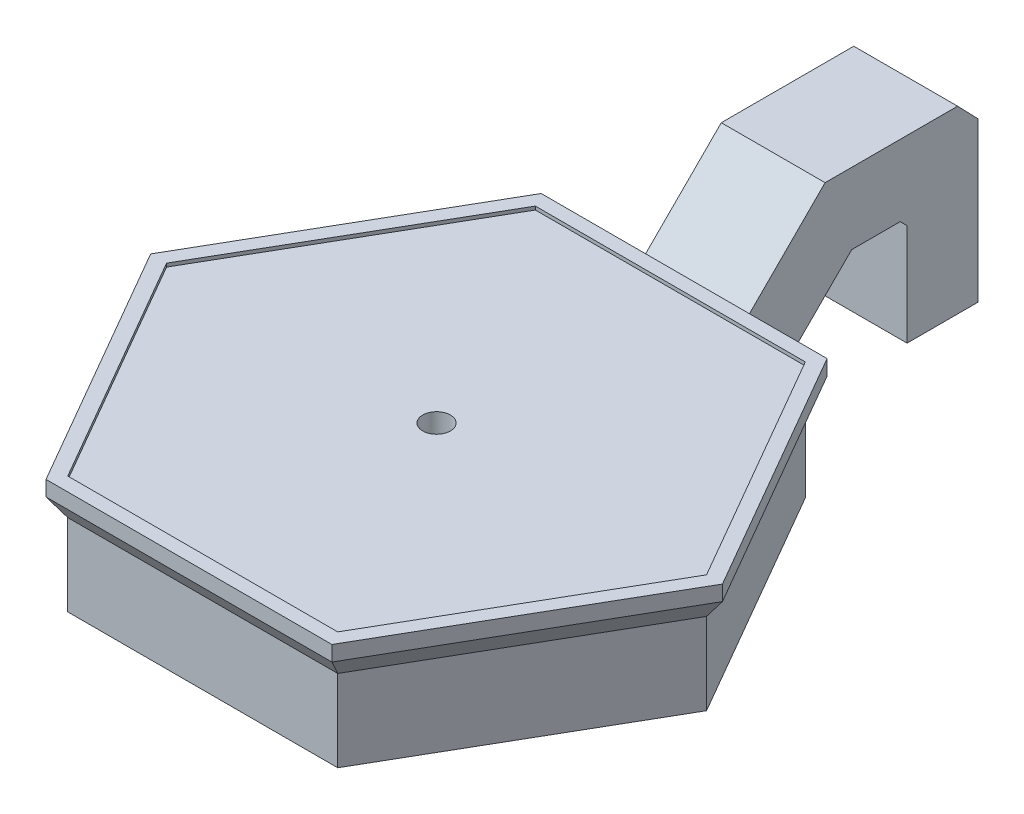
ISO-10303-21;
HEADER;
FILE_DESCRIPTION(('STEP AP214'),'2;1');
FILE_NAME('part.step','',(''),(''),'','','');
FILE_SCHEMA(('AUTOMOTIVE_DESIGN { 1 0 10303 214 1 1 1 1 }'));
ENDSEC;
DATA;
#1=APPLICATION_CONTEXT('core data for automotive mechanical design processes');
#2=APPLICATION_PROTOCOL_DEFINITION('international standard','automotive_design',2000,#1);
#3=PRODUCT_CONTEXT('',#1,'mechanical');
#4=PRODUCT('Part','Part','',(#3));
#5=PRODUCT_RELATED_PRODUCT_CATEGORY('part','',(#4));
#6=PRODUCT_DEFINITION_FORMATION('','',#4);
#7=PRODUCT_DEFINITION_CONTEXT('part definition',#1,'design');
#8=PRODUCT_DEFINITION('design','',#6,#7);
#9=PRODUCT_DEFINITION_SHAPE('','',#8);
#10=(LENGTH_UNIT() NAMED_UNIT(*) SI_UNIT(.MILLI.,.METRE.));
#11=(NAMED_UNIT(*) PLANE_ANGLE_UNIT() SI_UNIT($,.RADIAN.));
#12=(NAMED_UNIT(*) SI_UNIT($,.STERADIAN.) SOLID_ANGLE_UNIT());
#13=UNCERTAINTY_MEASURE_WITH_UNIT(LENGTH_MEASURE(1.E-05),#10,'distance_accuracy_value','');
#14=(GEOMETRIC_REPRESENTATION_CONTEXT(3) GLOBAL_UNCERTAINTY_ASSIGNED_CONTEXT((#13)) GLOBAL_UNIT_ASSIGNED_CONTEXT((#10,
#11,#12)) REPRESENTATION_CONTEXT('',''));
#15=CARTESIAN_POINT('',(0.,0.,0.));
#16=DIRECTION('',(0.,0.,1.));
#17=DIRECTION('',(1.,0.,0.));
#18=AXIS2_PLACEMENT_3D('',#15,#16,#17);
#19=CARTESIAN_POINT('',(19.5,11.8,-33.7749907475931));
#20=DIRECTION('',(0.,0.,1.));
#21=DIRECTION('',(1.,0.,0.));
#22=AXIS2_PLACEMENT_3D('',#19,#20,#21);
#23=PLANE('',#22);
#24=DIRECTION('',(0.,-1.,0.));
#25=VECTOR('',#24,1.);
#26=CARTESIAN_POINT('',(7.5,11.8,-33.7749907475931));
#27=LINE('',#26,#25);
#28=CARTESIAN_POINT('',(7.5,11.8,-33.7749907475931));
#29=VERTEX_POINT('',#28);
#30=CARTESIAN_POINT('',(7.5,0.,-33.7749907475931));
#31=VERTEX_POINT('',#30);
#32=EDGE_CURVE('E288',#29,#31,#27,.T.);
#33=ORIENTED_EDGE('',*,*,#32,.F.);
#34=DIRECTION('',(1.,0.,0.));
#35=VECTOR('',#34,1.);
#36=CARTESIAN_POINT('',(0.,11.8,-33.7749907475931));
#37=LINE('',#36,#35);
#38=CARTESIAN_POINT('',(19.5,11.8,-33.7749907475931));
#39=VERTEX_POINT('',#38);
#40=EDGE_CURVE('E659',#39,#29,#37,.F.);
#41=ORIENTED_EDGE('',*,*,#40,.F.);
#42=DIRECTION('',(0.,-1.,0.));
#43=VECTOR('',#42,1.);
#44=CARTESIAN_POINT('',(19.5,11.8,-33.7749907475931));
#45=LINE('',#44,#43);
#46=CARTESIAN_POINT('',(19.5,0.,-33.7749907475931));
#47=VERTEX_POINT('',#46);
#48=EDGE_CURVE('E689',#39,#47,#45,.T.);
#49=ORIENTED_EDGE('',*,*,#48,.T.);
#50=DIRECTION('',(-1.,0.,0.));
#51=VECTOR('',#50,1.);
#52=CARTESIAN_POINT('',(19.5,0.,-33.7749907475931));
#53=LINE('',#52,#51);
#54=EDGE_CURVE('E697',#47,#31,#53,.T.);
#55=ORIENTED_EDGE('',*,*,#54,.T.);
#56=EDGE_LOOP('',(#33,#41,#49,#55));
#57=FACE_BOUND('',#56,.T.);
#58=ADVANCED_FACE('F50',(#57),#23,.F.);
#59=CARTESIAN_POINT('',(-19.5,11.8,33.7749907475931));
#60=DIRECTION('',(0.,0.,-1.));
#61=DIRECTION('',(-1.,0.,0.));
#62=AXIS2_PLACEMENT_3D('',#59,#60,#61);
#63=PLANE('',#62);
#64=DIRECTION('',(1.,0.,0.));
#65=VECTOR('',#64,1.);
#66=CARTESIAN_POINT('',(-19.5,0.,33.7749907475931));
#67=LINE('',#66,#65);
#68=CARTESIAN_POINT('',(-19.5,0.,33.7749907475931));
#69=VERTEX_POINT('',#68);
#70=CARTESIAN_POINT('',(19.5,0.,33.7749907475931));
#71=VERTEX_POINT('',#70);
#72=EDGE_CURVE('E417',#69,#71,#67,.T.);
#73=ORIENTED_EDGE('',*,*,#72,.T.);
#74=DIRECTION('',(0.,-1.,0.));
#75=VECTOR('',#74,1.);
#76=CARTESIAN_POINT('',(19.5,11.8,33.7749907475931));
#77=LINE('',#76,#75);
#78=CARTESIAN_POINT('',(19.5,11.8,33.7749907475931));
#79=VERTEX_POINT('',#78);
#80=EDGE_CURVE('E12',#79,#71,#77,.T.);
#81=ORIENTED_EDGE('',*,*,#80,.F.);
#82=DIRECTION('',(1.,0.,0.));
#83=VECTOR('',#82,1.);
#84=CARTESIAN_POINT('',(0.,11.8,33.7749907475931));
#85=LINE('',#84,#83);
#86=CARTESIAN_POINT('',(-19.5,11.8,33.7749907475931));
#87=VERTEX_POINT('',#86);
#88=EDGE_CURVE('E671',#87,#79,#85,.T.);
#89=ORIENTED_EDGE('',*,*,#88,.F.);
#90=DIRECTION('',(0.,-1.,0.));
#91=VECTOR('',#90,1.);
#92=CARTESIAN_POINT('',(-19.5,11.8,33.7749907475931));
#93=LINE('',#92,#91);
#94=EDGE_CURVE('E678',#87,#69,#93,.T.);
#95=ORIENTED_EDGE('',*,*,#94,.T.);
#96=EDGE_LOOP('',(#73,#81,#89,#95));
#97=FACE_BOUND('',#96,.T.);
#98=ADVANCED_FACE('F52',(#97),#63,.F.);
#99=CARTESIAN_POINT('',(19.5,11.8,33.7749907475931));
#100=DIRECTION('',(-0.866025403784439,0.,-0.5));
#101=DIRECTION('',(-0.5,0.,0.866025403784439));
#102=AXIS2_PLACEMENT_3D('',#99,#100,#101);
#103=PLANE('',#102);
#104=DIRECTION('',(0.5,0.,-0.866025403784439));
#105=VECTOR('',#104,1.);
#106=CARTESIAN_POINT('',(19.5,0.,33.7749907475931));
#107=LINE('',#106,#105);
#108=CARTESIAN_POINT('',(39.,0.,0.));
#109=VERTEX_POINT('',#108);
#110=EDGE_CURVE('E703',#71,#109,#107,.T.);
#111=ORIENTED_EDGE('',*,*,#110,.T.);
#112=DIRECTION('',(0.,-1.,0.));
#113=VECTOR('',#112,1.);
#114=CARTESIAN_POINT('',(39.,11.8,0.));
#115=LINE('',#114,#113);
#116=CARTESIAN_POINT('',(39.,11.8,0.));
#117=VERTEX_POINT('',#116);
#118=EDGE_CURVE('E60',#117,#109,#115,.T.);
#119=ORIENTED_EDGE('',*,*,#118,.F.);
#120=DIRECTION('',(0.5,0.,-0.866025403784439));
#121=VECTOR('',#120,1.);
#122=CARTESIAN_POINT('',(19.5,11.8,33.7749907475931));
#123=LINE('',#122,#121);
#124=EDGE_CURVE('E668',#79,#117,#123,.T.);
#125=ORIENTED_EDGE('',*,*,#124,.F.);
#126=ORIENTED_EDGE('',*,*,#80,.T.);
#127=EDGE_LOOP('',(#111,#119,#125,#126));
#128=FACE_BOUND('',#127,.T.);
#129=ADVANCED_FACE('F715',(#128),#103,.F.);
#130=CARTESIAN_POINT('',(39.,11.8,0.));
#131=DIRECTION('',(-0.866025403784438,0.,0.5));
#132=DIRECTION('',(0.5,0.,0.866025403784438));
#133=AXIS2_PLACEMENT_3D('',#130,#131,#132);
#134=PLANE('',#133);
#135=DIRECTION('',(-0.5,0.,-0.866025403784438));
#136=VECTOR('',#135,1.);
#137=CARTESIAN_POINT('',(39.,0.,0.));
#138=LINE('',#137,#136);
#139=EDGE_CURVE('E701',#109,#47,#138,.T.);
#140=ORIENTED_EDGE('',*,*,#139,.T.);
#141=ORIENTED_EDGE('',*,*,#48,.F.);
#142=DIRECTION('',(-0.5,0.,-0.866025403784438));
#143=VECTOR('',#142,1.);
#144=CARTESIAN_POINT('',(39.,11.8,0.));
#145=LINE('',#144,#143);
#146=EDGE_CURVE('E665',#117,#39,#145,.T.);
#147=ORIENTED_EDGE('',*,*,#146,.F.);
#148=ORIENTED_EDGE('',*,*,#118,.T.);
#149=EDGE_LOOP('',(#140,#141,#147,#148));
#150=FACE_BOUND('',#149,.T.);
#151=ADVANCED_FACE('F774',(#150),#134,.F.);
#152=CARTESIAN_POINT('',(-7.5,11.8,-33.7749907475931));
#153=VERTEX_POINT('',#152);
#154=CARTESIAN_POINT('',(-19.5,11.8,-33.7749907475931));
#155=VERTEX_POINT('',#154);
#156=EDGE_CURVE('E664',#153,#155,#37,.F.);
#157=ORIENTED_EDGE('',*,*,#156,.F.);
#158=DIRECTION('',(0.,-1.,0.));
#159=VECTOR('',#158,1.);
#160=CARTESIAN_POINT('',(-7.5,11.8,-33.7749907475931));
#161=LINE('',#160,#159);
#162=CARTESIAN_POINT('',(-7.5,0.,-33.7749907475931));
#163=VERTEX_POINT('',#162);
#164=EDGE_CURVE('E315',#153,#163,#161,.T.);
#165=ORIENTED_EDGE('',*,*,#164,.T.);
#166=CARTESIAN_POINT('',(-19.5,0.,-33.7749907475931));
#167=VERTEX_POINT('',#166);
#168=EDGE_CURVE('E700',#163,#167,#53,.T.);
#169=ORIENTED_EDGE('',*,*,#168,.T.);
#170=DIRECTION('',(0.,-1.,0.));
#171=VECTOR('',#170,1.);
#172=CARTESIAN_POINT('',(-19.5,11.8,-33.7749907475931));
#173=LINE('',#172,#171);
#174=EDGE_CURVE('E684',#155,#167,#173,.T.);
#175=ORIENTED_EDGE('',*,*,#174,.F.);
#176=EDGE_LOOP('',(#157,#165,#169,#175));
#177=FACE_BOUND('',#176,.T.);
#178=ADVANCED_FACE('F766',(#177),#23,.F.);
#179=CARTESIAN_POINT('',(-19.5,11.8,-33.7749907475931));
#180=DIRECTION('',(0.866025403784439,0.,0.5));
#181=DIRECTION('',(0.5,0.,-0.866025403784439));
#182=AXIS2_PLACEMENT_3D('',#179,#180,#181);
#183=PLANE('',#182);
#184=DIRECTION('',(-0.5,0.,0.866025403784439));
#185=VECTOR('',#184,1.);
#186=CARTESIAN_POINT('',(-19.5,0.,-33.7749907475931));
#187=LINE('',#186,#185);
#188=CARTESIAN_POINT('',(-39.,0.,0.));
#189=VERTEX_POINT('',#188);
#190=EDGE_CURVE('E695',#167,#189,#187,.T.);
#191=ORIENTED_EDGE('',*,*,#190,.T.);
#192=DIRECTION('',(0.,-1.,0.));
#193=VECTOR('',#192,1.);
#194=CARTESIAN_POINT('',(-39.,11.8,0.));
#195=LINE('',#194,#193);
#196=CARTESIAN_POINT('',(-39.,11.8,0.));
#197=VERTEX_POINT('',#196);
#198=EDGE_CURVE('E681',#197,#189,#195,.T.);
#199=ORIENTED_EDGE('',*,*,#198,.F.);
#200=DIRECTION('',(-0.5,0.,0.866025403784439));
#201=VECTOR('',#200,1.);
#202=CARTESIAN_POINT('',(-19.5,11.8,-33.7749907475931));
#203=LINE('',#202,#201);
#204=EDGE_CURVE('E663',#155,#197,#203,.T.);
#205=ORIENTED_EDGE('',*,*,#204,.F.);
#206=ORIENTED_EDGE('',*,*,#174,.T.);
#207=EDGE_LOOP('',(#191,#199,#205,#206));
#208=FACE_BOUND('',#207,.T.);
#209=ADVANCED_FACE('F773',(#208),#183,.F.);
#210=CARTESIAN_POINT('',(-39.,11.8,0.));
#211=DIRECTION('',(0.866025403784438,0.,-0.5));
#212=DIRECTION('',(-0.5,0.,-0.866025403784439));
#213=AXIS2_PLACEMENT_3D('',#210,#211,#212);
#214=PLANE('',#213);
#215=DIRECTION('',(0.5,0.,0.866025403784439));
#216=VECTOR('',#215,1.);
#217=CARTESIAN_POINT('',(-39.,0.,0.));
#218=LINE('',#217,#216);
#219=EDGE_CURVE('E674',#189,#69,#218,.T.);
#220=ORIENTED_EDGE('',*,*,#219,.T.);
#221=ORIENTED_EDGE('',*,*,#94,.F.);
#222=DIRECTION('',(0.5,0.,0.866025403784439));
#223=VECTOR('',#222,1.);
#224=CARTESIAN_POINT('',(-39.,11.8,0.));
#225=LINE('',#224,#223);
#226=EDGE_CURVE('E675',#197,#87,#225,.T.);
#227=ORIENTED_EDGE('',*,*,#226,.F.);
#228=ORIENTED_EDGE('',*,*,#198,.T.);
#229=EDGE_LOOP('',(#220,#221,#227,#228));
#230=FACE_BOUND('',#229,.T.);
#231=ADVANCED_FACE('F780',(#230),#214,.F.);
#232=CARTESIAN_POINT('',(0.,0.,0.));
#233=DIRECTION('',(0.,1.,0.));
#234=DIRECTION('',(0.,0.,1.));
#235=AXIS2_PLACEMENT_3D('',#232,#233,#234);
#236=PLANE('',#235);
#237=CARTESIAN_POINT('',(0.,0.,0.));
#238=DIRECTION('',(0.,1.,0.));
#239=DIRECTION('',(0.,0.,1.));
#240=AXIS2_PLACEMENT_3D('',#237,#238,#239);
#241=CIRCLE('',#240,2.);
#242=CARTESIAN_POINT('',(0.,0.,2.));
#243=VERTEX_POINT('',#242);
#244=EDGE_CURVE('E350',#243,#243,#241,.T.);
#245=ORIENTED_EDGE('',*,*,#244,.T.);
#246=EDGE_LOOP('',(#245));
#247=FACE_BOUND('',#246,.T.);
#248=ORIENTED_EDGE('',*,*,#72,.F.);
#249=ORIENTED_EDGE('',*,*,#219,.F.);
#250=ORIENTED_EDGE('',*,*,#190,.F.);
#251=ORIENTED_EDGE('',*,*,#168,.F.);
#252=DIRECTION('',(0.,0.,-1.));
#253=VECTOR('',#252,1.);
#254=CARTESIAN_POINT('',(-7.5,0.,-33.7749907475931));
#255=LINE('',#254,#253);
#256=CARTESIAN_POINT('',(-7.5,0.,-36.7749907475931));
#257=VERTEX_POINT('',#256);
#258=EDGE_CURVE('E313',#163,#257,#255,.T.);
#259=ORIENTED_EDGE('',*,*,#258,.T.);
#260=DIRECTION('',(-1.,0.,0.));
#261=VECTOR('',#260,1.);
#262=CARTESIAN_POINT('',(7.5,0.,-36.7749907475931));
#263=LINE('',#262,#261);
#264=CARTESIAN_POINT('',(7.5,0.,-36.7749907475931));
#265=VERTEX_POINT('',#264);
#266=EDGE_CURVE('E340',#265,#257,#263,.T.);
#267=ORIENTED_EDGE('',*,*,#266,.F.);
#268=DIRECTION('',(0.,0.,-1.));
#269=VECTOR('',#268,1.);
#270=CARTESIAN_POINT('',(7.5,0.,-33.7749907475931));
#271=LINE('',#270,#269);
#272=EDGE_CURVE('E286',#31,#265,#271,.T.);
#273=ORIENTED_EDGE('',*,*,#272,.F.);
#274=ORIENTED_EDGE('',*,*,#54,.F.);
#275=ORIENTED_EDGE('',*,*,#139,.F.);
#276=ORIENTED_EDGE('',*,*,#110,.F.);
#277=EDGE_LOOP('',(#248,#249,#250,#251,#259,#267,#273,#274,#275,#276));
#278=FACE_BOUND('',#277,.T.);
#279=ADVANCED_FACE('F525',(#247,#278),#236,.F.);
#280=CARTESIAN_POINT('',(0.,-11.9536148062464,18.0037114595882));
#281=DIRECTION('',(0.,0.553133980780463,-0.833092311395297));
#282=DIRECTION('',(0.,0.833092311395297,0.553133980780463));
#283=AXIS2_PLACEMENT_3D('',#280,#281,#282);
#284=PLANE('',#283);
#285=DIRECTION('',(0.304215771828563,0.793606361291918,0.52691717327086));
#286=VECTOR('',#285,1.);
#287=CARTESIAN_POINT('',(19.5,11.8,33.7749907475931));
#288=LINE('',#287,#286);
#289=CARTESIAN_POINT('',(20.65,14.8,35.7668491762973));
#290=VERTEX_POINT('',#289);
#291=EDGE_CURVE('E424',#79,#290,#288,.T.);
#292=ORIENTED_EDGE('',*,*,#291,.T.);
#293=DIRECTION('',(1.,0.,0.));
#294=VECTOR('',#293,1.);
#295=CARTESIAN_POINT('',(-20.65,14.8,35.7668491762973));
#296=LINE('',#295,#294);
#297=CARTESIAN_POINT('',(-20.6499999999996,14.8,35.7668491762975));
#298=VERTEX_POINT('',#297);
#299=EDGE_CURVE('E54',#298,#290,#296,.T.);
#300=ORIENTED_EDGE('',*,*,#299,.F.);
#301=DIRECTION('',(-0.304215771828564,0.793606361291918,0.52691717327086));
#302=VECTOR('',#301,1.);
#303=CARTESIAN_POINT('',(-19.5,11.8,33.7749907475931));
#304=LINE('',#303,#302);
#305=EDGE_CURVE('E421',#87,#298,#304,.T.);
#306=ORIENTED_EDGE('',*,*,#305,.F.);
#307=ORIENTED_EDGE('',*,*,#88,.T.);
#308=EDGE_LOOP('',(#292,#300,#306,#307));
#309=FACE_BOUND('',#308,.T.);
#310=ADVANCED_FACE('F468',(#309),#284,.F.);
#311=CARTESIAN_POINT('',(-15.5916714864085,-11.9536148062464,9.00185572979414));
#312=DIRECTION('',(0.721479105365824,0.553133980780461,-0.416546155697649));
#313=DIRECTION('',(-0.608431543657133,0.793606361291918,0.));
#314=AXIS2_PLACEMENT_3D('',#311,#312,#313);
#315=PLANE('',#314);
#316=ORIENTED_EDGE('',*,*,#305,.T.);
#317=DIRECTION('',(0.5,0.,0.866025403784438));
#318=VECTOR('',#317,1.);
#319=CARTESIAN_POINT('',(-41.3,14.8,0.));
#320=LINE('',#319,#318);
#321=CARTESIAN_POINT('',(-41.3,14.8,0.));
#322=VERTEX_POINT('',#321);
#323=EDGE_CURVE('E429',#322,#298,#320,.T.);
#324=ORIENTED_EDGE('',*,*,#323,.F.);
#325=DIRECTION('',(-0.608431543657133,0.793606361291918,0.));
#326=VECTOR('',#325,1.);
#327=CARTESIAN_POINT('',(-39.,11.8,0.));
#328=LINE('',#327,#326);
#329=EDGE_CURVE('E415',#197,#322,#328,.T.);
#330=ORIENTED_EDGE('',*,*,#329,.F.);
#331=ORIENTED_EDGE('',*,*,#226,.T.);
#332=EDGE_LOOP('',(#316,#324,#330,#331));
#333=FACE_BOUND('',#332,.T.);
#334=ADVANCED_FACE('F457',(#333),#315,.F.);
#335=CARTESIAN_POINT('',(15.5916714864085,-11.9536148062464,9.00185572979417));
#336=DIRECTION('',(-0.721479105365826,0.553133980780459,-0.41654615569765));
#337=DIRECTION('',(-0.60843154365713,-0.79360636129192,0.));
#338=AXIS2_PLACEMENT_3D('',#335,#336,#337);
#339=PLANE('',#338);
#340=DIRECTION('',(0.608431543657131,0.79360636129192,0.));
#341=VECTOR('',#340,1.);
#342=CARTESIAN_POINT('',(39.,11.8,0.));
#343=LINE('',#342,#341);
#344=CARTESIAN_POINT('',(41.3,14.8,0.));
#345=VERTEX_POINT('',#344);
#346=EDGE_CURVE('E423',#117,#345,#343,.T.);
#347=ORIENTED_EDGE('',*,*,#346,.T.);
#348=DIRECTION('',(0.5,0.,-0.866025403784439));
#349=VECTOR('',#348,1.);
#350=CARTESIAN_POINT('',(20.65,14.8,35.7668491762973));
#351=LINE('',#350,#349);
#352=EDGE_CURVE('E606',#290,#345,#351,.T.);
#353=ORIENTED_EDGE('',*,*,#352,.F.);
#354=ORIENTED_EDGE('',*,*,#291,.F.);
#355=ORIENTED_EDGE('',*,*,#124,.T.);
#356=EDGE_LOOP('',(#347,#353,#354,#355));
#357=FACE_BOUND('',#356,.T.);
#358=ADVANCED_FACE('F467',(#357),#339,.F.);
#359=CARTESIAN_POINT('',(15.5916714864084,-11.9536148062464,-9.00185572979413));
#360=DIRECTION('',(-0.721479105365824,0.553133980780461,0.416546155697649));
#361=DIRECTION('',(-0.608431543657132,-0.793606361291919,0.));
#362=AXIS2_PLACEMENT_3D('',#359,#360,#361);
#363=PLANE('',#362);
#364=DIRECTION('',(0.304215771828568,0.793606361291919,-0.526917173270855));
#365=VECTOR('',#364,1.);
#366=CARTESIAN_POINT('',(19.5,11.8,-33.7749907475931));
#367=LINE('',#366,#365);
#368=CARTESIAN_POINT('',(20.65,14.8,-35.7668491762973));
#369=VERTEX_POINT('',#368);
#370=EDGE_CURVE('E434',#39,#369,#367,.T.);
#371=ORIENTED_EDGE('',*,*,#370,.T.);
#372=DIRECTION('',(-0.5,0.,-0.866025403784439));
#373=VECTOR('',#372,1.);
#374=CARTESIAN_POINT('',(41.3,14.8,0.));
#375=LINE('',#374,#373);
#376=EDGE_CURVE('E492',#345,#369,#375,.T.);
#377=ORIENTED_EDGE('',*,*,#376,.F.);
#378=ORIENTED_EDGE('',*,*,#346,.F.);
#379=ORIENTED_EDGE('',*,*,#146,.T.);
#380=EDGE_LOOP('',(#371,#377,#378,#379));
#381=FACE_BOUND('',#380,.T.);
#382=ADVANCED_FACE('F474',(#381),#363,.F.);
#383=CARTESIAN_POINT('',(0.,-11.9536148062464,-18.0037114595883));
#384=DIRECTION('',(0.,0.55313398078046,0.833092311395299));
#385=DIRECTION('',(0.,-0.833092311395299,0.55313398078046));
#386=AXIS2_PLACEMENT_3D('',#383,#384,#385);
#387=PLANE('',#386);
#388=DIRECTION('',(-0.304215771828566,0.793606361291919,-0.526917173270857));
#389=VECTOR('',#388,1.);
#390=CARTESIAN_POINT('',(-19.5,11.8,-33.7749907475931));
#391=LINE('',#390,#389);
#392=CARTESIAN_POINT('',(-20.65,14.8,-35.7668491762973));
#393=VERTEX_POINT('',#392);
#394=EDGE_CURVE('E418',#155,#393,#391,.T.);
#395=ORIENTED_EDGE('',*,*,#394,.T.);
#396=DIRECTION('',(-1.,0.,0.));
#397=VECTOR('',#396,1.);
#398=CARTESIAN_POINT('',(20.65,14.8,-35.7668491762973));
#399=LINE('',#398,#397);
#400=EDGE_CURVE('E505',#369,#393,#399,.T.);
#401=ORIENTED_EDGE('',*,*,#400,.F.);
#402=ORIENTED_EDGE('',*,*,#370,.F.);
#403=ORIENTED_EDGE('',*,*,#40,.T.);
#404=DIRECTION('',(-1.,0.,0.));
#405=VECTOR('',#404,1.);
#406=CARTESIAN_POINT('',(7.5,11.8,-33.7749907475931));
#407=LINE('',#406,#405);
#408=EDGE_CURVE('E337',#29,#153,#407,.T.);
#409=ORIENTED_EDGE('',*,*,#408,.T.);
#410=ORIENTED_EDGE('',*,*,#156,.T.);
#411=EDGE_LOOP('',(#395,#401,#402,#403,#409,#410));
#412=FACE_BOUND('',#411,.T.);
#413=ADVANCED_FACE('F510',(#412),#387,.F.);
#414=CARTESIAN_POINT('',(-15.5916714864084,-11.9536148062464,-9.00185572979411));
#415=DIRECTION('',(0.721479105365824,0.553133980780462,0.416546155697649));
#416=DIRECTION('',(-0.608431543657133,0.793606361291918,0.));
#417=AXIS2_PLACEMENT_3D('',#414,#415,#416);
#418=PLANE('',#417);
#419=ORIENTED_EDGE('',*,*,#329,.T.);
#420=DIRECTION('',(-0.5,0.,0.866025403784439));
#421=VECTOR('',#420,1.);
#422=CARTESIAN_POINT('',(-20.65,14.8,-35.7668491762973));
#423=LINE('',#422,#421);
#424=EDGE_CURVE('E541',#393,#322,#423,.T.);
#425=ORIENTED_EDGE('',*,*,#424,.F.);
#426=ORIENTED_EDGE('',*,*,#394,.F.);
#427=ORIENTED_EDGE('',*,*,#204,.T.);
#428=EDGE_LOOP('',(#419,#425,#426,#427));
#429=FACE_BOUND('',#428,.T.);
#430=ADVANCED_FACE('F519',(#429),#418,.F.);
#431=CARTESIAN_POINT('',(-20.6499999999996,17.,35.7668491762975));
#432=DIRECTION('',(0.,0.,-1.));
#433=DIRECTION('',(-1.,0.,0.));
#434=AXIS2_PLACEMENT_3D('',#431,#432,#433);
#435=PLANE('',#434);
#436=ORIENTED_EDGE('',*,*,#299,.T.);
#437=DIRECTION('',(0.,-1.,0.));
#438=VECTOR('',#437,1.);
#439=CARTESIAN_POINT('',(20.65,17.,35.7668491762973));
#440=LINE('',#439,#438);
#441=CARTESIAN_POINT('',(20.65,17.,35.7668491762973));
#442=VERTEX_POINT('',#441);
#443=EDGE_CURVE('E613',#442,#290,#440,.T.);
#444=ORIENTED_EDGE('',*,*,#443,.F.);
#445=DIRECTION('',(1.,0.,0.));
#446=VECTOR('',#445,1.);
#447=CARTESIAN_POINT('',(-20.6499999999996,17.,35.7668491762975));
#448=LINE('',#447,#446);
#449=CARTESIAN_POINT('',(-20.6499999999996,17.,35.7668491762975));
#450=VERTEX_POINT('',#449);
#451=EDGE_CURVE('E392',#450,#442,#448,.T.);
#452=ORIENTED_EDGE('',*,*,#451,.F.);
#453=DIRECTION('',(0.,-1.,0.));
#454=VECTOR('',#453,1.);
#455=CARTESIAN_POINT('',(-20.6499999999996,17.,35.7668491762975));
#456=LINE('',#455,#454);
#457=EDGE_CURVE('E414',#450,#298,#456,.T.);
#458=ORIENTED_EDGE('',*,*,#457,.T.);
#459=EDGE_LOOP('',(#436,#444,#452,#458));
#460=FACE_BOUND('',#459,.T.);
#461=ADVANCED_FACE('F523',(#460),#435,.F.);
#462=CARTESIAN_POINT('',(20.65,17.,35.7668491762973));
#463=DIRECTION('',(-0.866025403784439,0.,-0.499999999999999));
#464=DIRECTION('',(-0.499999999999999,0.,0.866025403784439));
#465=AXIS2_PLACEMENT_3D('',#462,#463,#464);
#466=PLANE('',#465);
#467=ORIENTED_EDGE('',*,*,#352,.T.);
#468=DIRECTION('',(0.,-1.,0.));
#469=VECTOR('',#468,1.);
#470=CARTESIAN_POINT('',(41.3,17.,0.));
#471=LINE('',#470,#469);
#472=CARTESIAN_POINT('',(41.3,17.,0.));
#473=VERTEX_POINT('',#472);
#474=EDGE_CURVE('E610',#473,#345,#471,.T.);
#475=ORIENTED_EDGE('',*,*,#474,.F.);
#476=DIRECTION('',(0.499999999999999,0.,-0.866025403784439));
#477=VECTOR('',#476,1.);
#478=CARTESIAN_POINT('',(20.65,17.,35.7668491762973));
#479=LINE('',#478,#477);
#480=EDGE_CURVE('E404',#442,#473,#479,.T.);
#481=ORIENTED_EDGE('',*,*,#480,.F.);
#482=ORIENTED_EDGE('',*,*,#443,.T.);
#483=EDGE_LOOP('',(#467,#475,#481,#482));
#484=FACE_BOUND('',#483,.T.);
#485=ADVANCED_FACE('F625',(#484),#466,.F.);
#486=CARTESIAN_POINT('',(41.3,17.,0.));
#487=DIRECTION('',(-0.866025403784437,0.,0.500000000000003));
#488=DIRECTION('',(0.500000000000003,0.,0.866025403784437));
#489=AXIS2_PLACEMENT_3D('',#486,#487,#488);
#490=PLANE('',#489);
#491=ORIENTED_EDGE('',*,*,#376,.T.);
#492=DIRECTION('',(0.,-1.,0.));
#493=VECTOR('',#492,1.);
#494=CARTESIAN_POINT('',(20.6499999999998,17.,-35.7668491762974));
#495=LINE('',#494,#493);
#496=CARTESIAN_POINT('',(20.6499999999998,17.,-35.7668491762974));
#497=VERTEX_POINT('',#496);
#498=EDGE_CURVE('E594',#497,#369,#495,.T.);
#499=ORIENTED_EDGE('',*,*,#498,.F.);
#500=DIRECTION('',(-0.500000000000003,0.,-0.866025403784437));
#501=VECTOR('',#500,1.);
#502=CARTESIAN_POINT('',(41.3,17.,0.));
#503=LINE('',#502,#501);
#504=EDGE_CURVE('E406',#473,#497,#503,.T.);
#505=ORIENTED_EDGE('',*,*,#504,.F.);
#506=ORIENTED_EDGE('',*,*,#474,.T.);
#507=EDGE_LOOP('',(#491,#499,#505,#506));
#508=FACE_BOUND('',#507,.T.);
#509=ADVANCED_FACE('F577',(#508),#490,.F.);
#510=CARTESIAN_POINT('',(20.6499999999998,17.,-35.7668491762974));
#511=DIRECTION('',(0.,0.,1.));
#512=DIRECTION('',(1.,0.,0.));
#513=AXIS2_PLACEMENT_3D('',#510,#511,#512);
#514=PLANE('',#513);
#515=ORIENTED_EDGE('',*,*,#400,.T.);
#516=DIRECTION('',(0.,-1.,0.));
#517=VECTOR('',#516,1.);
#518=CARTESIAN_POINT('',(-20.6500000000002,17.,-35.7668491762972));
#519=LINE('',#518,#517);
#520=CARTESIAN_POINT('',(-20.6500000000002,17.,-35.7668491762972));
#521=VERTEX_POINT('',#520);
#522=EDGE_CURVE('E549',#521,#393,#519,.T.);
#523=ORIENTED_EDGE('',*,*,#522,.F.);
#524=DIRECTION('',(-1.,0.,0.));
#525=VECTOR('',#524,1.);
#526=CARTESIAN_POINT('',(20.6499999999998,17.,-35.7668491762974));
#527=LINE('',#526,#525);
#528=EDGE_CURVE('E408',#497,#521,#527,.T.);
#529=ORIENTED_EDGE('',*,*,#528,.F.);
#530=ORIENTED_EDGE('',*,*,#498,.T.);
#531=EDGE_LOOP('',(#515,#523,#529,#530));
#532=FACE_BOUND('',#531,.T.);
#533=ADVANCED_FACE('F571',(#532),#514,.F.);
#534=CARTESIAN_POINT('',(-20.6500000000002,17.,-35.7668491762972));
#535=DIRECTION('',(0.866025403784443,0.,0.499999999999993));
#536=DIRECTION('',(0.499999999999993,0.,-0.866025403784443));
#537=AXIS2_PLACEMENT_3D('',#534,#535,#536);
#538=PLANE('',#537);
#539=ORIENTED_EDGE('',*,*,#424,.T.);
#540=DIRECTION('',(0.,-1.,0.));
#541=VECTOR('',#540,1.);
#542=CARTESIAN_POINT('',(-41.3,17.,3.78169717762944E-13));
#543=LINE('',#542,#541);
#544=CARTESIAN_POINT('',(-41.3,17.,3.78169717762944E-13));
#545=VERTEX_POINT('',#544);
#546=EDGE_CURVE('E546',#545,#322,#543,.T.);
#547=ORIENTED_EDGE('',*,*,#546,.F.);
#548=DIRECTION('',(-0.499999999999993,0.,0.866025403784443));
#549=VECTOR('',#548,1.);
#550=CARTESIAN_POINT('',(-20.6500000000002,17.,-35.7668491762972));
#551=LINE('',#550,#549);
#552=EDGE_CURVE('E410',#521,#545,#551,.T.);
#553=ORIENTED_EDGE('',*,*,#552,.F.);
#554=ORIENTED_EDGE('',*,*,#522,.T.);
#555=EDGE_LOOP('',(#539,#547,#553,#554));
#556=FACE_BOUND('',#555,.T.);
#557=ADVANCED_FACE('F561',(#556),#538,.F.);
#558=CARTESIAN_POINT('',(-41.3,17.,3.78169717762944E-13));
#559=DIRECTION('',(0.866025403784434,0.,-0.500000000000009));
#560=DIRECTION('',(-0.500000000000009,0.,-0.866025403784434));
#561=AXIS2_PLACEMENT_3D('',#558,#559,#560);
#562=PLANE('',#561);
#563=ORIENTED_EDGE('',*,*,#323,.T.);
#564=ORIENTED_EDGE('',*,*,#457,.F.);
#565=DIRECTION('',(0.500000000000009,0.,0.866025403784434));
#566=VECTOR('',#565,1.);
#567=CARTESIAN_POINT('',(-41.3,17.,3.78169717762944E-13));
#568=LINE('',#567,#566);
#569=EDGE_CURVE('E412',#545,#450,#568,.T.);
#570=ORIENTED_EDGE('',*,*,#569,.F.);
#571=ORIENTED_EDGE('',*,*,#546,.T.);
#572=EDGE_LOOP('',(#563,#564,#570,#571));
#573=FACE_BOUND('',#572,.T.);
#574=ADVANCED_FACE('F570',(#573),#562,.F.);
#575=CARTESIAN_POINT('',(0.,17.,0.));
#576=DIRECTION('',(0.,1.,0.));
#577=DIRECTION('',(0.,0.,1.));
#578=AXIS2_PLACEMENT_3D('',#575,#576,#577);
#579=PLANE('',#578);
#580=DIRECTION('',(1.,0.,0.));
#581=VECTOR('',#580,1.);
#582=CARTESIAN_POINT('',(-19.5,17.,33.7749907475931));
#583=LINE('',#582,#581);
#584=CARTESIAN_POINT('',(-19.5,17.,33.7749907475931));
#585=VERTEX_POINT('',#584);
#586=CARTESIAN_POINT('',(19.5,17.,33.7749907475931));
#587=VERTEX_POINT('',#586);
#588=EDGE_CURVE('E76',#585,#587,#583,.T.);
#589=ORIENTED_EDGE('',*,*,#588,.F.);
#590=DIRECTION('',(0.5,0.,0.866025403784439));
#591=VECTOR('',#590,1.);
#592=CARTESIAN_POINT('',(-39.,17.,0.));
#593=LINE('',#592,#591);
#594=CARTESIAN_POINT('',(-39.,17.,0.));
#595=VERTEX_POINT('',#594);
#596=EDGE_CURVE('E359',#595,#585,#593,.T.);
#597=ORIENTED_EDGE('',*,*,#596,.F.);
#598=DIRECTION('',(-0.5,0.,0.866025403784439));
#599=VECTOR('',#598,1.);
#600=CARTESIAN_POINT('',(-19.5,17.,-33.7749907475931));
#601=LINE('',#600,#599);
#602=CARTESIAN_POINT('',(-19.5,17.,-33.7749907475931));
#603=VERTEX_POINT('',#602);
#604=EDGE_CURVE('E385',#603,#595,#601,.T.);
#605=ORIENTED_EDGE('',*,*,#604,.F.);
#606=DIRECTION('',(-1.,0.,0.));
#607=VECTOR('',#606,1.);
#608=CARTESIAN_POINT('',(19.5,17.,-33.7749907475931));
#609=LINE('',#608,#607);
#610=CARTESIAN_POINT('',(19.5,17.,-33.7749907475931));
#611=VERTEX_POINT('',#610);
#612=EDGE_CURVE('E382',#611,#603,#609,.T.);
#613=ORIENTED_EDGE('',*,*,#612,.F.);
#614=DIRECTION('',(-0.5,0.,-0.866025403784439));
#615=VECTOR('',#614,1.);
#616=CARTESIAN_POINT('',(39.,17.,0.));
#617=LINE('',#616,#615);
#618=CARTESIAN_POINT('',(39.,17.,0.));
#619=VERTEX_POINT('',#618);
#620=EDGE_CURVE('E379',#619,#611,#617,.T.);
#621=ORIENTED_EDGE('',*,*,#620,.F.);
#622=DIRECTION('',(0.5,0.,-0.866025403784439));
#623=VECTOR('',#622,1.);
#624=CARTESIAN_POINT('',(19.5,17.,33.7749907475931));
#625=LINE('',#624,#623);
#626=EDGE_CURVE('E376',#587,#619,#625,.T.);
#627=ORIENTED_EDGE('',*,*,#626,.F.);
#628=EDGE_LOOP('',(#589,#597,#605,#613,#621,#627));
#629=FACE_BOUND('',#628,.T.);
#630=ORIENTED_EDGE('',*,*,#451,.T.);
#631=ORIENTED_EDGE('',*,*,#480,.T.);
#632=ORIENTED_EDGE('',*,*,#504,.T.);
#633=ORIENTED_EDGE('',*,*,#528,.T.);
#634=ORIENTED_EDGE('',*,*,#552,.T.);
#635=ORIENTED_EDGE('',*,*,#569,.T.);
#636=EDGE_LOOP('',(#630,#631,#632,#633,#634,#635));
#637=FACE_BOUND('',#636,.T.);
#638=ADVANCED_FACE('F652',(#629,#637),#579,.T.);
#639=CARTESIAN_POINT('',(-19.5,16.5,33.7749907475931));
#640=DIRECTION('',(0.,0.,1.));
#641=DIRECTION('',(1.,0.,0.));
#642=AXIS2_PLACEMENT_3D('',#639,#640,#641);
#643=PLANE('',#642);
#644=ORIENTED_EDGE('',*,*,#588,.T.);
#645=DIRECTION('',(0.,1.,0.));
#646=VECTOR('',#645,1.);
#647=CARTESIAN_POINT('',(19.5,16.5,33.7749907475931));
#648=LINE('',#647,#646);
#649=CARTESIAN_POINT('',(19.5,16.5,33.7749907475931));
#650=VERTEX_POINT('',#649);
#651=EDGE_CURVE('E374',#650,#587,#648,.T.);
#652=ORIENTED_EDGE('',*,*,#651,.F.);
#653=DIRECTION('',(1.,0.,0.));
#654=VECTOR('',#653,1.);
#655=CARTESIAN_POINT('',(-19.5,16.5,33.7749907475931));
#656=LINE('',#655,#654);
#657=CARTESIAN_POINT('',(-19.5,16.5,33.7749907475931));
#658=VERTEX_POINT('',#657);
#659=EDGE_CURVE('E355',#658,#650,#656,.T.);
#660=ORIENTED_EDGE('',*,*,#659,.F.);
#661=DIRECTION('',(0.,1.,0.));
#662=VECTOR('',#661,1.);
#663=CARTESIAN_POINT('',(-19.5,16.5,33.7749907475931));
#664=LINE('',#663,#662);
#665=EDGE_CURVE('E390',#658,#585,#664,.T.);
#666=ORIENTED_EDGE('',*,*,#665,.T.);
#667=EDGE_LOOP('',(#644,#652,#660,#666));
#668=FACE_BOUND('',#667,.T.);
#669=ADVANCED_FACE('F814',(#668),#643,.F.);
#670=CARTESIAN_POINT('',(-39.,16.5,0.));
#671=DIRECTION('',(-0.866025403784439,0.,0.5));
#672=DIRECTION('',(0.5,0.,0.866025403784439));
#673=AXIS2_PLACEMENT_3D('',#670,#671,#672);
#674=PLANE('',#673);
#675=ORIENTED_EDGE('',*,*,#596,.T.);
#676=ORIENTED_EDGE('',*,*,#665,.F.);
#677=DIRECTION('',(0.5,0.,0.866025403784439));
#678=VECTOR('',#677,1.);
#679=CARTESIAN_POINT('',(-39.,16.5,0.));
#680=LINE('',#679,#678);
#681=CARTESIAN_POINT('',(-39.,16.5,0.));
#682=VERTEX_POINT('',#681);
#683=EDGE_CURVE('E371',#682,#658,#680,.T.);
#684=ORIENTED_EDGE('',*,*,#683,.F.);
#685=DIRECTION('',(0.,1.,0.));
#686=VECTOR('',#685,1.);
#687=CARTESIAN_POINT('',(-39.,16.5,0.));
#688=LINE('',#687,#686);
#689=EDGE_CURVE('E393',#682,#595,#688,.T.);
#690=ORIENTED_EDGE('',*,*,#689,.T.);
#691=EDGE_LOOP('',(#675,#676,#684,#690));
#692=FACE_BOUND('',#691,.T.);
#693=ADVANCED_FACE('F831',(#692),#674,.F.);
#694=CARTESIAN_POINT('',(-19.5,16.5,-33.7749907475931));
#695=DIRECTION('',(-0.866025403784439,0.,-0.5));
#696=DIRECTION('',(-0.5,0.,0.866025403784439));
#697=AXIS2_PLACEMENT_3D('',#694,#695,#696);
#698=PLANE('',#697);
#699=ORIENTED_EDGE('',*,*,#604,.T.);
#700=ORIENTED_EDGE('',*,*,#689,.F.);
#701=DIRECTION('',(-0.5,0.,0.866025403784439));
#702=VECTOR('',#701,1.);
#703=CARTESIAN_POINT('',(-19.5,16.5,-33.7749907475931));
#704=LINE('',#703,#702);
#705=CARTESIAN_POINT('',(-19.5,16.5,-33.7749907475931));
#706=VERTEX_POINT('',#705);
#707=EDGE_CURVE('E368',#706,#682,#704,.T.);
#708=ORIENTED_EDGE('',*,*,#707,.F.);
#709=DIRECTION('',(0.,1.,0.));
#710=VECTOR('',#709,1.);
#711=CARTESIAN_POINT('',(-19.5,16.5,-33.7749907475931));
#712=LINE('',#711,#710);
#713=EDGE_CURVE('E395',#706,#603,#712,.T.);
#714=ORIENTED_EDGE('',*,*,#713,.T.);
#715=EDGE_LOOP('',(#699,#700,#708,#714));
#716=FACE_BOUND('',#715,.T.);
#717=ADVANCED_FACE('F828',(#716),#698,.F.);
#718=CARTESIAN_POINT('',(19.5,16.5,-33.7749907475931));
#719=DIRECTION('',(0.,0.,-1.));
#720=DIRECTION('',(-1.,0.,0.));
#721=AXIS2_PLACEMENT_3D('',#718,#719,#720);
#722=PLANE('',#721);
#723=ORIENTED_EDGE('',*,*,#612,.T.);
#724=ORIENTED_EDGE('',*,*,#713,.F.);
#725=DIRECTION('',(-1.,0.,0.));
#726=VECTOR('',#725,1.);
#727=CARTESIAN_POINT('',(19.5,16.5,-33.7749907475931));
#728=LINE('',#727,#726);
#729=CARTESIAN_POINT('',(19.5,16.5,-33.7749907475931));
#730=VERTEX_POINT('',#729);
#731=EDGE_CURVE('E365',#730,#706,#728,.T.);
#732=ORIENTED_EDGE('',*,*,#731,.F.);
#733=DIRECTION('',(0.,1.,0.));
#734=VECTOR('',#733,1.);
#735=CARTESIAN_POINT('',(19.5,16.5,-33.7749907475931));
#736=LINE('',#735,#734);
#737=EDGE_CURVE('E397',#730,#611,#736,.T.);
#738=ORIENTED_EDGE('',*,*,#737,.T.);
#739=EDGE_LOOP('',(#723,#724,#732,#738));
#740=FACE_BOUND('',#739,.T.);
#741=ADVANCED_FACE('F824',(#740),#722,.F.);
#742=CARTESIAN_POINT('',(39.,16.5,0.));
#743=DIRECTION('',(0.866025403784438,0.,-0.5));
#744=DIRECTION('',(-0.5,0.,-0.866025403784439));
#745=AXIS2_PLACEMENT_3D('',#742,#743,#744);
#746=PLANE('',#745);
#747=ORIENTED_EDGE('',*,*,#620,.T.);
#748=ORIENTED_EDGE('',*,*,#737,.F.);
#749=DIRECTION('',(-0.5,0.,-0.866025403784439));
#750=VECTOR('',#749,1.);
#751=CARTESIAN_POINT('',(39.,16.5,0.));
#752=LINE('',#751,#750);
#753=CARTESIAN_POINT('',(39.,16.5,0.));
#754=VERTEX_POINT('',#753);
#755=EDGE_CURVE('E362',#754,#730,#752,.T.);
#756=ORIENTED_EDGE('',*,*,#755,.F.);
#757=DIRECTION('',(0.,1.,0.));
#758=VECTOR('',#757,1.);
#759=CARTESIAN_POINT('',(39.,16.5,0.));
#760=LINE('',#759,#758);
#761=EDGE_CURVE('E399',#754,#619,#760,.T.);
#762=ORIENTED_EDGE('',*,*,#761,.T.);
#763=EDGE_LOOP('',(#747,#748,#756,#762));
#764=FACE_BOUND('',#763,.T.);
#765=ADVANCED_FACE('F820',(#764),#746,.F.);
#766=CARTESIAN_POINT('',(19.5,16.5,33.7749907475931));
#767=DIRECTION('',(0.866025403784439,0.,0.5));
#768=DIRECTION('',(0.5,0.,-0.866025403784439));
#769=AXIS2_PLACEMENT_3D('',#766,#767,#768);
#770=PLANE('',#769);
#771=ORIENTED_EDGE('',*,*,#626,.T.);
#772=ORIENTED_EDGE('',*,*,#761,.F.);
#773=DIRECTION('',(0.5,0.,-0.866025403784439));
#774=VECTOR('',#773,1.);
#775=CARTESIAN_POINT('',(19.5,16.5,33.7749907475931));
#776=LINE('',#775,#774);
#777=EDGE_CURVE('E358',#650,#754,#776,.T.);
#778=ORIENTED_EDGE('',*,*,#777,.F.);
#779=ORIENTED_EDGE('',*,*,#651,.T.);
#780=EDGE_LOOP('',(#771,#772,#778,#779));
#781=FACE_BOUND('',#780,.T.);
#782=ADVANCED_FACE('F809',(#781),#770,.F.);
#783=CARTESIAN_POINT('',(0.,16.5,0.));
#784=DIRECTION('',(0.,1.,0.));
#785=DIRECTION('',(0.,0.,1.));
#786=AXIS2_PLACEMENT_3D('',#783,#784,#785);
#787=PLANE('',#786);
#788=CARTESIAN_POINT('',(0.,16.5,0.));
#789=DIRECTION('',(0.,1.,0.));
#790=DIRECTION('',(0.,0.,1.));
#791=AXIS2_PLACEMENT_3D('',#788,#789,#790);
#792=CIRCLE('',#791,2.);
#793=CARTESIAN_POINT('',(0.,16.5,2.));
#794=VERTEX_POINT('',#793);
#795=EDGE_CURVE('E328',#794,#794,#792,.T.);
#796=ORIENTED_EDGE('',*,*,#795,.F.);
#797=EDGE_LOOP('',(#796));
#798=FACE_BOUND('',#797,.T.);
#799=ORIENTED_EDGE('',*,*,#659,.T.);
#800=ORIENTED_EDGE('',*,*,#777,.T.);
#801=ORIENTED_EDGE('',*,*,#755,.T.);
#802=ORIENTED_EDGE('',*,*,#731,.T.);
#803=ORIENTED_EDGE('',*,*,#707,.T.);
#804=ORIENTED_EDGE('',*,*,#683,.T.);
#805=EDGE_LOOP('',(#799,#800,#801,#802,#803,#804));
#806=FACE_BOUND('',#805,.T.);
#807=ADVANCED_FACE('F803',(#798,#806),#787,.T.);
#808=CARTESIAN_POINT('',(0.,0.,0.));
#809=DIRECTION('',(0.,1.,0.));
#810=DIRECTION('',(0.,0.,1.));
#811=AXIS2_PLACEMENT_3D('',#808,#809,#810);
#812=CYLINDRICAL_SURFACE('',#811,2.);
#813=ORIENTED_EDGE('',*,*,#244,.F.);
#814=EDGE_LOOP('',(#813));
#815=FACE_BOUND('',#814,.T.);
#816=ORIENTED_EDGE('',*,*,#795,.T.);
#817=EDGE_LOOP('',(#816));
#818=FACE_BOUND('',#817,.T.);
#819=ADVANCED_FACE('F800',(#815,#818),#812,.F.);
#820=CARTESIAN_POINT('',(7.5,0.,-70.7169464045651));
#821=DIRECTION('',(0.,-1.,0.));
#822=DIRECTION('',(0.,0.,-1.));
#823=AXIS2_PLACEMENT_3D('',#820,#821,#822);
#824=PLANE('',#823);
#825=DIRECTION('',(0.,0.,1.));
#826=VECTOR('',#825,1.);
#827=CARTESIAN_POINT('',(-7.5,0.,-70.7169464045651));
#828=LINE('',#827,#826);
#829=CARTESIAN_POINT('',(-7.5,0.,-70.7169464045651));
#830=VERTEX_POINT('',#829);
#831=CARTESIAN_POINT('',(-7.5,0.,-60.4697818514075));
#832=VERTEX_POINT('',#831);
#833=EDGE_CURVE('E303',#830,#832,#828,.T.);
#834=ORIENTED_EDGE('',*,*,#833,.F.);
#835=DIRECTION('',(-1.,0.,0.));
#836=VECTOR('',#835,1.);
#837=CARTESIAN_POINT('',(7.5,0.,-70.7169464045651));
#838=LINE('',#837,#836);
#839=CARTESIAN_POINT('',(7.5,0.,-70.7169464045651));
#840=VERTEX_POINT('',#839);
#841=EDGE_CURVE('E274',#840,#830,#838,.T.);
#842=ORIENTED_EDGE('',*,*,#841,.F.);
#843=DIRECTION('',(0.,0.,1.));
#844=VECTOR('',#843,1.);
#845=CARTESIAN_POINT('',(7.5,0.,-70.7169464045651));
#846=LINE('',#845,#844);
#847=CARTESIAN_POINT('',(7.5,0.,-60.4697818514075));
#848=VERTEX_POINT('',#847);
#849=EDGE_CURVE('E267',#840,#848,#846,.T.);
#850=ORIENTED_EDGE('',*,*,#849,.T.);
#851=DIRECTION('',(-1.,0.,0.));
#852=VECTOR('',#851,1.);
#853=CARTESIAN_POINT('',(7.5,0.,-60.4697818514075));
#854=LINE('',#853,#852);
#855=EDGE_CURVE('E250',#848,#832,#854,.T.);
#856=ORIENTED_EDGE('',*,*,#855,.T.);
#857=EDGE_LOOP('',(#834,#842,#850,#856));
#858=FACE_BOUND('',#857,.T.);
#859=ADVANCED_FACE('F273',(#858),#824,.T.);
#860=CARTESIAN_POINT('',(7.5,22.94870341279,-70.7169464045651));
#861=DIRECTION('',(0.,0.,-1.));
#862=DIRECTION('',(-1.,0.,0.));
#863=AXIS2_PLACEMENT_3D('',#860,#861,#862);
#864=PLANE('',#863);
#865=DIRECTION('',(0.,-1.,0.));
#866=VECTOR('',#865,1.);
#867=CARTESIAN_POINT('',(-7.5,22.94870341279,-70.7169464045651));
#868=LINE('',#867,#866);
#869=CARTESIAN_POINT('',(-7.5,22.94870341279,-70.7169464045651));
#870=VERTEX_POINT('',#869);
#871=EDGE_CURVE('E275',#870,#830,#868,.T.);
#872=ORIENTED_EDGE('',*,*,#871,.F.);
#873=DIRECTION('',(-1.,0.,0.));
#874=VECTOR('',#873,1.);
#875=CARTESIAN_POINT('',(7.5,22.94870341279,-70.7169464045651));
#876=LINE('',#875,#874);
#877=CARTESIAN_POINT('',(7.5,22.94870341279,-70.7169464045651));
#878=VERTEX_POINT('',#877);
#879=EDGE_CURVE('E329',#878,#870,#876,.T.);
#880=ORIENTED_EDGE('',*,*,#879,.F.);
#881=DIRECTION('',(0.,-1.,0.));
#882=VECTOR('',#881,1.);
#883=CARTESIAN_POINT('',(7.5,22.94870341279,-70.7169464045651));
#884=LINE('',#883,#882);
#885=EDGE_CURVE('E261',#878,#840,#884,.T.);
#886=ORIENTED_EDGE('',*,*,#885,.T.);
#887=ORIENTED_EDGE('',*,*,#841,.T.);
#888=EDGE_LOOP('',(#872,#880,#886,#887));
#889=FACE_BOUND('',#888,.T.);
#890=ADVANCED_FACE('F745',(#889),#864,.T.);
#891=CARTESIAN_POINT('',(7.5,25.9987041662259,-67.771594913819));
#892=DIRECTION('',(0.,0.694658370458997,-0.719339800338652));
#893=DIRECTION('',(0.,0.719339800338652,0.694658370458997));
#894=AXIS2_PLACEMENT_3D('',#891,#892,#893);
#895=PLANE('',#894);
#896=DIRECTION('',(0.,-0.719339800338652,-0.694658370458997));
#897=VECTOR('',#896,1.);
#898=CARTESIAN_POINT('',(-7.5,25.9987041662259,-67.771594913819));
#899=LINE('',#898,#897);
#900=CARTESIAN_POINT('',(-7.5,25.9987041662259,-67.771594913819));
#901=VERTEX_POINT('',#900);
#902=EDGE_CURVE('E278',#901,#870,#899,.T.);
#903=ORIENTED_EDGE('',*,*,#902,.F.);
#904=DIRECTION('',(-1.,0.,0.));
#905=VECTOR('',#904,1.);
#906=CARTESIAN_POINT('',(7.5,25.9987041662259,-67.771594913819));
#907=LINE('',#906,#905);
#908=CARTESIAN_POINT('',(7.5,25.9987041662259,-67.771594913819));
#909=VERTEX_POINT('',#908);
#910=EDGE_CURVE('E331',#909,#901,#907,.T.);
#911=ORIENTED_EDGE('',*,*,#910,.F.);
#912=DIRECTION('',(0.,-0.719339800338652,-0.694658370458997));
#913=VECTOR('',#912,1.);
#914=CARTESIAN_POINT('',(7.5,25.9987041662259,-67.771594913819));
#915=LINE('',#914,#913);
#916=EDGE_CURVE('E299',#909,#878,#915,.T.);
#917=ORIENTED_EDGE('',*,*,#916,.T.);
#918=ORIENTED_EDGE('',*,*,#879,.T.);
#919=EDGE_LOOP('',(#903,#911,#917,#918));
#920=FACE_BOUND('',#919,.T.);
#921=ADVANCED_FACE('F912',(#920),#895,.T.);
#922=CARTESIAN_POINT('',(7.5,25.9987041662259,-48.631594913819));
#923=DIRECTION('',(0.,1.,0.));
#924=DIRECTION('',(0.,0.,1.));
#925=AXIS2_PLACEMENT_3D('',#922,#923,#924);
#926=PLANE('',#925);
#927=DIRECTION('',(0.,0.,-1.));
#928=VECTOR('',#927,1.);
#929=CARTESIAN_POINT('',(-7.5,25.9987041662259,-48.631594913819));
#930=LINE('',#929,#928);
#931=CARTESIAN_POINT('',(-7.5,25.9987041662259,-48.631594913819));
#932=VERTEX_POINT('',#931);
#933=EDGE_CURVE('E322',#932,#901,#930,.T.);
#934=ORIENTED_EDGE('',*,*,#933,.F.);
#935=DIRECTION('',(-1.,0.,0.));
#936=VECTOR('',#935,1.);
#937=CARTESIAN_POINT('',(7.5,25.9987041662259,-48.631594913819));
#938=LINE('',#937,#936);
#939=CARTESIAN_POINT('',(7.5,25.9987041662259,-48.631594913819));
#940=VERTEX_POINT('',#939);
#941=EDGE_CURVE('E333',#940,#932,#938,.T.);
#942=ORIENTED_EDGE('',*,*,#941,.F.);
#943=DIRECTION('',(0.,0.,-1.));
#944=VECTOR('',#943,1.);
#945=CARTESIAN_POINT('',(7.5,25.9987041662259,-48.631594913819));
#946=LINE('',#945,#944);
#947=EDGE_CURVE('E296',#940,#909,#946,.T.);
#948=ORIENTED_EDGE('',*,*,#947,.T.);
#949=ORIENTED_EDGE('',*,*,#910,.T.);
#950=EDGE_LOOP('',(#934,#942,#948,#949));
#951=FACE_BOUND('',#950,.T.);
#952=ADVANCED_FACE('F751',(#951),#926,.T.);
#953=CARTESIAN_POINT('',(7.5,11.8,-34.4328907475931));
#954=DIRECTION('',(0.,0.707106781186546,0.707106781186549));
#955=DIRECTION('',(0.,-0.707106781186549,0.707106781186546));
#956=AXIS2_PLACEMENT_3D('',#953,#954,#955);
#957=PLANE('',#956);
#958=DIRECTION('',(0.,0.707106781186549,-0.707106781186546));
#959=VECTOR('',#958,1.);
#960=CARTESIAN_POINT('',(-7.5,11.8,-34.4328907475931));
#961=LINE('',#960,#959);
#962=CARTESIAN_POINT('',(-7.5,11.8,-34.4328907475931));
#963=VERTEX_POINT('',#962);
#964=EDGE_CURVE('E319',#963,#932,#961,.T.);
#965=ORIENTED_EDGE('',*,*,#964,.F.);
#966=DIRECTION('',(-1.,0.,0.));
#967=VECTOR('',#966,1.);
#968=CARTESIAN_POINT('',(7.5,11.8,-34.4328907475931));
#969=LINE('',#968,#967);
#970=CARTESIAN_POINT('',(7.5,11.8,-34.4328907475931));
#971=VERTEX_POINT('',#970);
#972=EDGE_CURVE('E335',#971,#963,#969,.T.);
#973=ORIENTED_EDGE('',*,*,#972,.F.);
#974=DIRECTION('',(0.,0.707106781186549,-0.707106781186546));
#975=VECTOR('',#974,1.);
#976=CARTESIAN_POINT('',(7.5,11.8,-34.4328907475931));
#977=LINE('',#976,#975);
#978=EDGE_CURVE('E293',#971,#940,#977,.T.);
#979=ORIENTED_EDGE('',*,*,#978,.T.);
#980=ORIENTED_EDGE('',*,*,#941,.T.);
#981=EDGE_LOOP('',(#965,#973,#979,#980));
#982=FACE_BOUND('',#981,.T.);
#983=ADVANCED_FACE('F754',(#982),#957,.T.);
#984=CARTESIAN_POINT('',(7.5,11.8,-33.7749907475931));
#985=DIRECTION('',(0.,1.,0.));
#986=DIRECTION('',(0.,0.,1.));
#987=AXIS2_PLACEMENT_3D('',#984,#985,#986);
#988=PLANE('',#987);
#989=DIRECTION('',(0.,0.,-1.));
#990=VECTOR('',#989,1.);
#991=CARTESIAN_POINT('',(-7.5,11.8,-33.7749907475931));
#992=LINE('',#991,#990);
#993=EDGE_CURVE('E68',#153,#963,#992,.T.);
#994=ORIENTED_EDGE('',*,*,#993,.F.);
#995=ORIENTED_EDGE('',*,*,#408,.F.);
#996=DIRECTION('',(0.,0.,-1.));
#997=VECTOR('',#996,1.);
#998=CARTESIAN_POINT('',(7.5,11.8,-33.7749907475931));
#999=LINE('',#998,#997);
#1000=EDGE_CURVE('E290',#29,#971,#999,.T.);
#1001=ORIENTED_EDGE('',*,*,#1000,.T.);
#1002=ORIENTED_EDGE('',*,*,#972,.T.);
#1003=EDGE_LOOP('',(#994,#995,#1001,#1002));
#1004=FACE_BOUND('',#1003,.T.);
#1005=ADVANCED_FACE('F755',(#1004),#988,.T.);
#1006=CARTESIAN_POINT('',(7.5,0.,-36.7749907475931));
#1007=DIRECTION('',(0.,0.707106781186546,0.707106781186549));
#1008=DIRECTION('',(0.,-0.707106781186549,0.707106781186546));
#1009=AXIS2_PLACEMENT_3D('',#1006,#1007,#1008);
#1010=PLANE('',#1009);
#1011=DIRECTION('',(0.,0.707106781186549,-0.707106781186546));
#1012=VECTOR('',#1011,1.);
#1013=CARTESIAN_POINT('',(-7.5,0.,-36.7749907475931));
#1014=LINE('',#1013,#1012);
#1015=CARTESIAN_POINT('',(-7.5,15.6977705423414,-52.4727612899345));
#1016=VERTEX_POINT('',#1015);
#1017=EDGE_CURVE('E311',#257,#1016,#1014,.T.);
#1018=ORIENTED_EDGE('',*,*,#1017,.T.);
#1019=DIRECTION('',(-1.,0.,0.));
#1020=VECTOR('',#1019,1.);
#1021=CARTESIAN_POINT('',(7.5,15.6977705423414,-52.4727612899345));
#1022=LINE('',#1021,#1020);
#1023=CARTESIAN_POINT('',(7.5,15.6977705423414,-52.4727612899345));
#1024=VERTEX_POINT('',#1023);
#1025=EDGE_CURVE('E343',#1024,#1016,#1022,.T.);
#1026=ORIENTED_EDGE('',*,*,#1025,.F.);
#1027=DIRECTION('',(0.,0.707106781186549,-0.707106781186546));
#1028=VECTOR('',#1027,1.);
#1029=CARTESIAN_POINT('',(7.5,0.,-36.7749907475931));
#1030=LINE('',#1029,#1028);
#1031=EDGE_CURVE('E284',#265,#1024,#1030,.T.);
#1032=ORIENTED_EDGE('',*,*,#1031,.F.);
#1033=ORIENTED_EDGE('',*,*,#266,.T.);
#1034=EDGE_LOOP('',(#1018,#1026,#1032,#1033));
#1035=FACE_BOUND('',#1034,.T.);
#1036=ADVANCED_FACE('F731',(#1035),#1010,.F.);
#1037=CARTESIAN_POINT('',(7.5,15.6977705423414,-52.4727612899345));
#1038=DIRECTION('',(0.,1.,0.));
#1039=DIRECTION('',(0.,0.,1.));
#1040=AXIS2_PLACEMENT_3D('',#1037,#1038,#1039);
#1041=PLANE('',#1040);
#1042=DIRECTION('',(0.,0.,-1.));
#1043=VECTOR('',#1042,1.);
#1044=CARTESIAN_POINT('',(-7.5,15.6977705423414,-52.4727612899345));
#1045=LINE('',#1044,#1043);
#1046=CARTESIAN_POINT('',(-7.5,15.6977705423414,-59.4727612899345));
#1047=VERTEX_POINT('',#1046);
#1048=EDGE_CURVE('E309',#1016,#1047,#1045,.T.);
#1049=ORIENTED_EDGE('',*,*,#1048,.T.);
#1050=DIRECTION('',(-1.,0.,0.));
#1051=VECTOR('',#1050,1.);
#1052=CARTESIAN_POINT('',(7.5,15.6977705423414,-59.4727612899345));
#1053=LINE('',#1052,#1051);
#1054=CARTESIAN_POINT('',(7.5,15.6977705423414,-59.4727612899345));
#1055=VERTEX_POINT('',#1054);
#1056=EDGE_CURVE('E346',#1055,#1047,#1053,.T.);
#1057=ORIENTED_EDGE('',*,*,#1056,.F.);
#1058=DIRECTION('',(0.,0.,-1.));
#1059=VECTOR('',#1058,1.);
#1060=CARTESIAN_POINT('',(7.5,15.6977705423414,-52.4727612899345));
#1061=LINE('',#1060,#1059);
#1062=EDGE_CURVE('E282',#1024,#1055,#1061,.T.);
#1063=ORIENTED_EDGE('',*,*,#1062,.F.);
#1064=ORIENTED_EDGE('',*,*,#1025,.T.);
#1065=EDGE_LOOP('',(#1049,#1057,#1063,#1064));
#1066=FACE_BOUND('',#1065,.T.);
#1067=ADVANCED_FACE('F735',(#1066),#1041,.F.);
#1068=CARTESIAN_POINT('',(7.5,15.6977705423414,-59.4727612899345));
#1069=DIRECTION('',(0.,0.707106781186554,-0.707106781186541));
#1070=DIRECTION('',(0.,0.707106781186541,0.707106781186554));
#1071=AXIS2_PLACEMENT_3D('',#1068,#1069,#1070);
#1072=PLANE('',#1071);
#1073=DIRECTION('',(0.,-0.707106781186541,-0.707106781186554));
#1074=VECTOR('',#1073,1.);
#1075=CARTESIAN_POINT('',(-7.5,15.6977705423414,-59.4727612899345));
#1076=LINE('',#1075,#1074);
#1077=CARTESIAN_POINT('',(-7.5,14.7007499808684,-60.4697818514075));
#1078=VERTEX_POINT('',#1077);
#1079=EDGE_CURVE('E306',#1047,#1078,#1076,.T.);
#1080=ORIENTED_EDGE('',*,*,#1079,.T.);
#1081=DIRECTION('',(-1.,0.,0.));
#1082=VECTOR('',#1081,1.);
#1083=CARTESIAN_POINT('',(7.5,14.7007499808684,-60.4697818514075));
#1084=LINE('',#1083,#1082);
#1085=CARTESIAN_POINT('',(7.5,14.7007499808684,-60.4697818514075));
#1086=VERTEX_POINT('',#1085);
#1087=EDGE_CURVE('E260',#1086,#1078,#1084,.T.);
#1088=ORIENTED_EDGE('',*,*,#1087,.F.);
#1089=DIRECTION('',(0.,-0.707106781186541,-0.707106781186554));
#1090=VECTOR('',#1089,1.);
#1091=CARTESIAN_POINT('',(7.5,15.6977705423414,-59.4727612899345));
#1092=LINE('',#1091,#1090);
#1093=EDGE_CURVE('E270',#1055,#1086,#1092,.T.);
#1094=ORIENTED_EDGE('',*,*,#1093,.F.);
#1095=ORIENTED_EDGE('',*,*,#1056,.T.);
#1096=EDGE_LOOP('',(#1080,#1088,#1094,#1095));
#1097=FACE_BOUND('',#1096,.T.);
#1098=ADVANCED_FACE('F739',(#1097),#1072,.F.);
#1099=CARTESIAN_POINT('',(7.5,0.,-60.4697818514075));
#1100=DIRECTION('',(0.,0.,1.));
#1101=DIRECTION('',(0.,-1.,0.));
#1102=AXIS2_PLACEMENT_3D('',#1099,#1100,#1101);
#1103=PLANE('',#1102);
#1104=DIRECTION('',(0.,1.,0.));
#1105=VECTOR('',#1104,1.);
#1106=CARTESIAN_POINT('',(-7.5,0.,-60.4697818514075));
#1107=LINE('',#1106,#1105);
#1108=EDGE_CURVE('E255',#832,#1078,#1107,.T.);
#1109=ORIENTED_EDGE('',*,*,#1108,.F.);
#1110=ORIENTED_EDGE('',*,*,#855,.F.);
#1111=DIRECTION('',(0.,1.,0.));
#1112=VECTOR('',#1111,1.);
#1113=CARTESIAN_POINT('',(7.5,0.,-60.4697818514075));
#1114=LINE('',#1113,#1112);
#1115=EDGE_CURVE('E253',#848,#1086,#1114,.T.);
#1116=ORIENTED_EDGE('',*,*,#1115,.T.);
#1117=ORIENTED_EDGE('',*,*,#1087,.T.);
#1118=EDGE_LOOP('',(#1109,#1110,#1116,#1117));
#1119=FACE_BOUND('',#1118,.T.);
#1120=ADVANCED_FACE('F252',(#1119),#1103,.T.);
#1121=CARTESIAN_POINT('',(7.5,0.,0.));
#1122=DIRECTION('',(-1.,0.,0.));
#1123=DIRECTION('',(0.,0.,1.));
#1124=AXIS2_PLACEMENT_3D('',#1121,#1122,#1123);
#1125=PLANE('',#1124);
#1126=ORIENTED_EDGE('',*,*,#849,.F.);
#1127=ORIENTED_EDGE('',*,*,#885,.F.);
#1128=ORIENTED_EDGE('',*,*,#916,.F.);
#1129=ORIENTED_EDGE('',*,*,#947,.F.);
#1130=ORIENTED_EDGE('',*,*,#978,.F.);
#1131=ORIENTED_EDGE('',*,*,#1000,.F.);
#1132=ORIENTED_EDGE('',*,*,#32,.T.);
#1133=ORIENTED_EDGE('',*,*,#272,.T.);
#1134=ORIENTED_EDGE('',*,*,#1031,.T.);
#1135=ORIENTED_EDGE('',*,*,#1062,.T.);
#1136=ORIENTED_EDGE('',*,*,#1093,.T.);
#1137=ORIENTED_EDGE('',*,*,#1115,.F.);
#1138=EDGE_LOOP('',(#1126,#1127,#1128,#1129,#1130,#1131,#1132,#1133,#1134,#1135,#1136,#1137));
#1139=FACE_BOUND('',#1138,.T.);
#1140=ADVANCED_FACE('F265',(#1139),#1125,.F.);
#1141=CARTESIAN_POINT('',(-7.5,0.,0.));
#1142=DIRECTION('',(-1.,0.,0.));
#1143=DIRECTION('',(0.,0.,1.));
#1144=AXIS2_PLACEMENT_3D('',#1141,#1142,#1143);
#1145=PLANE('',#1144);
#1146=ORIENTED_EDGE('',*,*,#833,.T.);
#1147=ORIENTED_EDGE('',*,*,#1108,.T.);
#1148=ORIENTED_EDGE('',*,*,#1079,.F.);
#1149=ORIENTED_EDGE('',*,*,#1048,.F.);
#1150=ORIENTED_EDGE('',*,*,#1017,.F.);
#1151=ORIENTED_EDGE('',*,*,#258,.F.);
#1152=ORIENTED_EDGE('',*,*,#164,.F.);
#1153=ORIENTED_EDGE('',*,*,#993,.T.);
#1154=ORIENTED_EDGE('',*,*,#964,.T.);
#1155=ORIENTED_EDGE('',*,*,#933,.T.);
#1156=ORIENTED_EDGE('',*,*,#902,.T.);
#1157=ORIENTED_EDGE('',*,*,#871,.T.);
#1158=EDGE_LOOP('',(#1146,#1147,#1148,#1149,#1150,#1151,#1152,#1153,#1154,#1155,#1156,#1157));
#1159=FACE_BOUND('',#1158,.T.);
#1160=ADVANCED_FACE('F741',(#1159),#1145,.T.);
#1161=CLOSED_SHELL('',(#58,#98,#129,#151,#178,#209,#231,#279,#310,#334,#358,#382,#413,#430,#461,
#485,#509,#533,#557,#574,#638,#669,#693,#717,#741,#765,#782,#807,#819,#859,#890,#921,#952,#983,
#1005,#1036,#1067,#1098,#1120,#1140,#1160));
#1162=MANIFOLD_SOLID_BREP('B2',#1161);
#1163=ADVANCED_BREP_SHAPE_REPRESENTATION('',(#18,#1162),#14);
#1164=SHAPE_DEFINITION_REPRESENTATION(#9,#1163);
ENDSEC;
END-ISO-10303-21;
